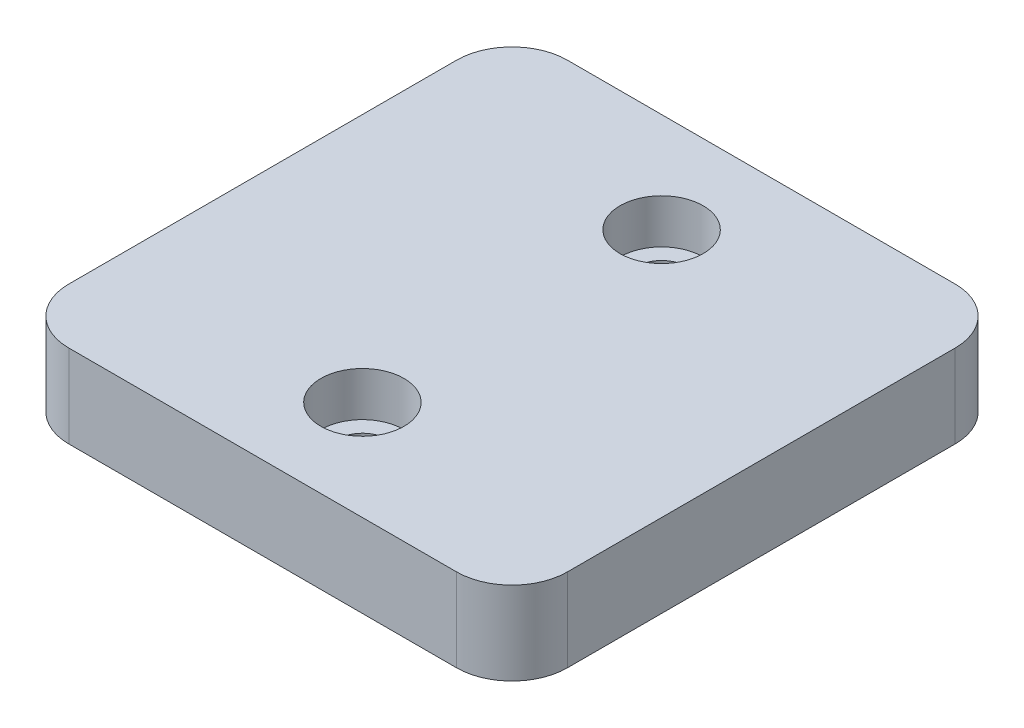
ISO-10303-21;
HEADER;
FILE_DESCRIPTION(('STEP AP214'),'2;1');
FILE_NAME('part.step','',(''),(''),'','','');
FILE_SCHEMA(('AUTOMOTIVE_DESIGN { 1 0 10303 214 1 1 1 1 }'));
ENDSEC;
DATA;
#1=APPLICATION_CONTEXT('core data for automotive mechanical design processes');
#2=APPLICATION_PROTOCOL_DEFINITION('international standard','automotive_design',2000,#1);
#3=PRODUCT_CONTEXT('',#1,'mechanical');
#4=PRODUCT('Part','Part','',(#3));
#5=PRODUCT_RELATED_PRODUCT_CATEGORY('part','',(#4));
#6=PRODUCT_DEFINITION_FORMATION('','',#4);
#7=PRODUCT_DEFINITION_CONTEXT('part definition',#1,'design');
#8=PRODUCT_DEFINITION('design','',#6,#7);
#9=PRODUCT_DEFINITION_SHAPE('','',#8);
#10=(LENGTH_UNIT() NAMED_UNIT(*) SI_UNIT(.MILLI.,.METRE.));
#11=(NAMED_UNIT(*) PLANE_ANGLE_UNIT() SI_UNIT($,.RADIAN.));
#12=(NAMED_UNIT(*) SI_UNIT($,.STERADIAN.) SOLID_ANGLE_UNIT());
#13=UNCERTAINTY_MEASURE_WITH_UNIT(LENGTH_MEASURE(1.E-05),#10,'distance_accuracy_value','');
#14=(GEOMETRIC_REPRESENTATION_CONTEXT(3) GLOBAL_UNCERTAINTY_ASSIGNED_CONTEXT((#13)) GLOBAL_UNIT_ASSIGNED_CONTEXT((#10,
#11,#12)) REPRESENTATION_CONTEXT('',''));
#15=CARTESIAN_POINT('',(0.,0.,0.));
#16=DIRECTION('',(0.,0.,1.));
#17=DIRECTION('',(1.,0.,0.));
#18=AXIS2_PLACEMENT_3D('',#15,#16,#17);
#19=CARTESIAN_POINT('',(35.,15.,35.));
#20=DIRECTION('',(0.,-1.,0.));
#21=DIRECTION('',(0.,0.,-1.));
#22=AXIS2_PLACEMENT_3D('',#19,#20,#21);
#23=CYLINDRICAL_SURFACE('',#22,10.);
#24=CARTESIAN_POINT('',(35.,0.,35.));
#25=DIRECTION('',(0.,1.,0.));
#26=DIRECTION('',(0.,0.,1.));
#27=AXIS2_PLACEMENT_3D('',#24,#25,#26);
#28=CIRCLE('',#27,10.);
#29=CARTESIAN_POINT('',(34.9999999999999,0.,45.));
#30=VERTEX_POINT('',#29);
#31=CARTESIAN_POINT('',(45.,0.,34.9999999999999));
#32=VERTEX_POINT('',#31);
#33=EDGE_CURVE('E134',#30,#32,#28,.T.);
#34=ORIENTED_EDGE('',*,*,#33,.T.);
#35=DIRECTION('',(0.,-1.,0.));
#36=VECTOR('',#35,1.);
#37=CARTESIAN_POINT('',(45.,15.,34.9999999999999));
#38=LINE('',#37,#36);
#39=CARTESIAN_POINT('',(45.,15.,34.9999999999999));
#40=VERTEX_POINT('',#39);
#41=EDGE_CURVE('E11',#40,#32,#38,.T.);
#42=ORIENTED_EDGE('',*,*,#41,.F.);
#43=CARTESIAN_POINT('',(35.,15.,35.));
#44=DIRECTION('',(0.,1.,0.));
#45=DIRECTION('',(0.,0.,1.));
#46=AXIS2_PLACEMENT_3D('',#43,#44,#45);
#47=CIRCLE('',#46,10.);
#48=CARTESIAN_POINT('',(34.9999999999999,15.,45.));
#49=VERTEX_POINT('',#48);
#50=EDGE_CURVE('E149',#49,#40,#47,.T.);
#51=ORIENTED_EDGE('',*,*,#50,.F.);
#52=DIRECTION('',(0.,-1.,0.));
#53=VECTOR('',#52,1.);
#54=CARTESIAN_POINT('',(34.9999999999999,15.,45.));
#55=LINE('',#54,#53);
#56=EDGE_CURVE('E130',#49,#30,#55,.T.);
#57=ORIENTED_EDGE('',*,*,#56,.T.);
#58=EDGE_LOOP('',(#34,#42,#51,#57));
#59=FACE_BOUND('',#58,.T.);
#60=ADVANCED_FACE('F36',(#59),#23,.T.);
#61=CARTESIAN_POINT('',(45.,15.,-34.9999999999999));
#62=DIRECTION('',(-1.,0.,0.));
#63=DIRECTION('',(0.,0.,1.));
#64=AXIS2_PLACEMENT_3D('',#61,#62,#63);
#65=PLANE('',#64);
#66=DIRECTION('',(0.,0.,-1.));
#67=VECTOR('',#66,1.);
#68=CARTESIAN_POINT('',(45.,0.,-34.9999999999999));
#69=LINE('',#68,#67);
#70=CARTESIAN_POINT('',(45.,0.,-34.9999999999999));
#71=VERTEX_POINT('',#70);
#72=EDGE_CURVE('E137',#32,#71,#69,.T.);
#73=ORIENTED_EDGE('',*,*,#72,.T.);
#74=DIRECTION('',(0.,-1.,0.));
#75=VECTOR('',#74,1.);
#76=CARTESIAN_POINT('',(45.,15.,-34.9999999999999));
#77=LINE('',#76,#75);
#78=CARTESIAN_POINT('',(45.,15.,-34.9999999999999));
#79=VERTEX_POINT('',#78);
#80=EDGE_CURVE('E45',#79,#71,#77,.T.);
#81=ORIENTED_EDGE('',*,*,#80,.F.);
#82=DIRECTION('',(0.,0.,-1.));
#83=VECTOR('',#82,1.);
#84=CARTESIAN_POINT('',(45.,15.,-34.9999999999999));
#85=LINE('',#84,#83);
#86=EDGE_CURVE('E97',#40,#79,#85,.T.);
#87=ORIENTED_EDGE('',*,*,#86,.F.);
#88=ORIENTED_EDGE('',*,*,#41,.T.);
#89=EDGE_LOOP('',(#73,#81,#87,#88));
#90=FACE_BOUND('',#89,.T.);
#91=ADVANCED_FACE('F219',(#90),#65,.F.);
#92=CARTESIAN_POINT('',(35.,15.,-35.));
#93=DIRECTION('',(0.,-1.,0.));
#94=DIRECTION('',(0.,0.,-1.));
#95=AXIS2_PLACEMENT_3D('',#92,#93,#94);
#96=CYLINDRICAL_SURFACE('',#95,10.);
#97=CARTESIAN_POINT('',(35.,0.,-35.));
#98=DIRECTION('',(0.,1.,0.));
#99=DIRECTION('',(0.,0.,-1.));
#100=AXIS2_PLACEMENT_3D('',#97,#98,#99);
#101=CIRCLE('',#100,10.);
#102=CARTESIAN_POINT('',(34.9999999999999,0.,-45.));
#103=VERTEX_POINT('',#102);
#104=EDGE_CURVE('E140',#71,#103,#101,.T.);
#105=ORIENTED_EDGE('',*,*,#104,.T.);
#106=DIRECTION('',(0.,-1.,0.));
#107=VECTOR('',#106,1.);
#108=CARTESIAN_POINT('',(34.9999999999999,15.,-45.));
#109=LINE('',#108,#107);
#110=CARTESIAN_POINT('',(34.9999999999999,15.,-45.));
#111=VERTEX_POINT('',#110);
#112=EDGE_CURVE('E156',#111,#103,#109,.T.);
#113=ORIENTED_EDGE('',*,*,#112,.F.);
#114=CARTESIAN_POINT('',(35.,15.,-35.));
#115=DIRECTION('',(0.,1.,0.));
#116=DIRECTION('',(0.,0.,-1.));
#117=AXIS2_PLACEMENT_3D('',#114,#115,#116);
#118=CIRCLE('',#117,10.);
#119=EDGE_CURVE('E187',#79,#111,#118,.T.);
#120=ORIENTED_EDGE('',*,*,#119,.F.);
#121=ORIENTED_EDGE('',*,*,#80,.T.);
#122=EDGE_LOOP('',(#105,#113,#120,#121));
#123=FACE_BOUND('',#122,.T.);
#124=ADVANCED_FACE('F223',(#123),#96,.T.);
#125=CARTESIAN_POINT('',(-34.9999999999999,15.,-45.));
#126=DIRECTION('',(0.,0.,1.));
#127=DIRECTION('',(1.,0.,0.));
#128=AXIS2_PLACEMENT_3D('',#125,#126,#127);
#129=PLANE('',#128);
#130=DIRECTION('',(-1.,0.,0.));
#131=VECTOR('',#130,1.);
#132=CARTESIAN_POINT('',(-34.9999999999999,0.,-45.));
#133=LINE('',#132,#131);
#134=CARTESIAN_POINT('',(-34.9999999999999,0.,-45.));
#135=VERTEX_POINT('',#134);
#136=EDGE_CURVE('E142',#103,#135,#133,.T.);
#137=ORIENTED_EDGE('',*,*,#136,.T.);
#138=DIRECTION('',(0.,-1.,0.));
#139=VECTOR('',#138,1.);
#140=CARTESIAN_POINT('',(-34.9999999999999,15.,-45.));
#141=LINE('',#140,#139);
#142=CARTESIAN_POINT('',(-34.9999999999999,15.,-45.));
#143=VERTEX_POINT('',#142);
#144=EDGE_CURVE('E153',#143,#135,#141,.T.);
#145=ORIENTED_EDGE('',*,*,#144,.F.);
#146=DIRECTION('',(-1.,0.,0.));
#147=VECTOR('',#146,1.);
#148=CARTESIAN_POINT('',(-34.9999999999999,15.,-45.));
#149=LINE('',#148,#147);
#150=EDGE_CURVE('E189',#111,#143,#149,.T.);
#151=ORIENTED_EDGE('',*,*,#150,.F.);
#152=ORIENTED_EDGE('',*,*,#112,.T.);
#153=EDGE_LOOP('',(#137,#145,#151,#152));
#154=FACE_BOUND('',#153,.T.);
#155=ADVANCED_FACE('F195',(#154),#129,.F.);
#156=CARTESIAN_POINT('',(-35.,15.,-35.));
#157=DIRECTION('',(0.,-1.,0.));
#158=DIRECTION('',(0.,0.,-1.));
#159=AXIS2_PLACEMENT_3D('',#156,#157,#158);
#160=CYLINDRICAL_SURFACE('',#159,10.);
#161=CARTESIAN_POINT('',(-35.,0.,-35.));
#162=DIRECTION('',(0.,1.,0.));
#163=DIRECTION('',(0.,0.,1.));
#164=AXIS2_PLACEMENT_3D('',#161,#162,#163);
#165=CIRCLE('',#164,10.);
#166=CARTESIAN_POINT('',(-45.,0.,-34.9999999999999));
#167=VERTEX_POINT('',#166);
#168=EDGE_CURVE('E144',#135,#167,#165,.T.);
#169=ORIENTED_EDGE('',*,*,#168,.T.);
#170=DIRECTION('',(0.,-1.,0.));
#171=VECTOR('',#170,1.);
#172=CARTESIAN_POINT('',(-45.,15.,-34.9999999999999));
#173=LINE('',#172,#171);
#174=CARTESIAN_POINT('',(-45.,15.,-34.9999999999999));
#175=VERTEX_POINT('',#174);
#176=EDGE_CURVE('E125',#175,#167,#173,.T.);
#177=ORIENTED_EDGE('',*,*,#176,.F.);
#178=CARTESIAN_POINT('',(-35.,15.,-35.));
#179=DIRECTION('',(0.,1.,0.));
#180=DIRECTION('',(0.,0.,1.));
#181=AXIS2_PLACEMENT_3D('',#178,#179,#180);
#182=CIRCLE('',#181,10.);
#183=EDGE_CURVE('E116',#143,#175,#182,.T.);
#184=ORIENTED_EDGE('',*,*,#183,.F.);
#185=ORIENTED_EDGE('',*,*,#144,.T.);
#186=EDGE_LOOP('',(#169,#177,#184,#185));
#187=FACE_BOUND('',#186,.T.);
#188=ADVANCED_FACE('F199',(#187),#160,.T.);
#189=CARTESIAN_POINT('',(-45.,15.,-34.9999999999999));
#190=DIRECTION('',(1.,0.,0.));
#191=DIRECTION('',(0.,0.,-1.));
#192=AXIS2_PLACEMENT_3D('',#189,#190,#191);
#193=PLANE('',#192);
#194=DIRECTION('',(0.,0.,1.));
#195=VECTOR('',#194,1.);
#196=CARTESIAN_POINT('',(-45.,0.,-34.9999999999999));
#197=LINE('',#196,#195);
#198=CARTESIAN_POINT('',(-45.,0.,34.9999999999999));
#199=VERTEX_POINT('',#198);
#200=EDGE_CURVE('E124',#167,#199,#197,.T.);
#201=ORIENTED_EDGE('',*,*,#200,.T.);
#202=DIRECTION('',(0.,-1.,0.));
#203=VECTOR('',#202,1.);
#204=CARTESIAN_POINT('',(-45.,15.,34.9999999999999));
#205=LINE('',#204,#203);
#206=CARTESIAN_POINT('',(-45.,15.,34.9999999999999));
#207=VERTEX_POINT('',#206);
#208=EDGE_CURVE('E121',#207,#199,#205,.T.);
#209=ORIENTED_EDGE('',*,*,#208,.F.);
#210=DIRECTION('',(0.,0.,1.));
#211=VECTOR('',#210,1.);
#212=CARTESIAN_POINT('',(-45.,15.,-34.9999999999999));
#213=LINE('',#212,#211);
#214=EDGE_CURVE('E110',#175,#207,#213,.T.);
#215=ORIENTED_EDGE('',*,*,#214,.F.);
#216=ORIENTED_EDGE('',*,*,#176,.T.);
#217=EDGE_LOOP('',(#201,#209,#215,#216));
#218=FACE_BOUND('',#217,.T.);
#219=ADVANCED_FACE('F122',(#218),#193,.F.);
#220=CARTESIAN_POINT('',(-35.,15.,35.));
#221=DIRECTION('',(0.,-1.,0.));
#222=DIRECTION('',(0.,0.,-1.));
#223=AXIS2_PLACEMENT_3D('',#220,#221,#222);
#224=CYLINDRICAL_SURFACE('',#223,10.);
#225=CARTESIAN_POINT('',(-35.,0.,35.));
#226=DIRECTION('',(0.,1.,0.));
#227=DIRECTION('',(0.,0.,1.));
#228=AXIS2_PLACEMENT_3D('',#225,#226,#227);
#229=CIRCLE('',#228,10.);
#230=CARTESIAN_POINT('',(-34.9999999999999,0.,45.));
#231=VERTEX_POINT('',#230);
#232=EDGE_CURVE('E83',#199,#231,#229,.T.);
#233=ORIENTED_EDGE('',*,*,#232,.T.);
#234=DIRECTION('',(0.,-1.,0.));
#235=VECTOR('',#234,1.);
#236=CARTESIAN_POINT('',(-34.9999999999999,15.,45.));
#237=LINE('',#236,#235);
#238=CARTESIAN_POINT('',(-34.9999999999999,15.,45.));
#239=VERTEX_POINT('',#238);
#240=EDGE_CURVE('E126',#239,#231,#237,.T.);
#241=ORIENTED_EDGE('',*,*,#240,.F.);
#242=CARTESIAN_POINT('',(-35.,15.,35.));
#243=DIRECTION('',(0.,1.,0.));
#244=DIRECTION('',(0.,0.,1.));
#245=AXIS2_PLACEMENT_3D('',#242,#243,#244);
#246=CIRCLE('',#245,10.);
#247=EDGE_CURVE('E114',#207,#239,#246,.T.);
#248=ORIENTED_EDGE('',*,*,#247,.F.);
#249=ORIENTED_EDGE('',*,*,#208,.T.);
#250=EDGE_LOOP('',(#233,#241,#248,#249));
#251=FACE_BOUND('',#250,.T.);
#252=ADVANCED_FACE('F128',(#251),#224,.T.);
#253=CARTESIAN_POINT('',(-34.9999999999999,15.,45.));
#254=DIRECTION('',(0.,0.,-1.));
#255=DIRECTION('',(-1.,0.,0.));
#256=AXIS2_PLACEMENT_3D('',#253,#254,#255);
#257=PLANE('',#256);
#258=DIRECTION('',(1.,0.,0.));
#259=VECTOR('',#258,1.);
#260=CARTESIAN_POINT('',(-34.9999999999999,0.,45.));
#261=LINE('',#260,#259);
#262=EDGE_CURVE('E89',#231,#30,#261,.T.);
#263=ORIENTED_EDGE('',*,*,#262,.T.);
#264=ORIENTED_EDGE('',*,*,#56,.F.);
#265=DIRECTION('',(1.,0.,0.));
#266=VECTOR('',#265,1.);
#267=CARTESIAN_POINT('',(-34.9999999999999,15.,45.));
#268=LINE('',#267,#266);
#269=EDGE_CURVE('E54',#239,#49,#268,.T.);
#270=ORIENTED_EDGE('',*,*,#269,.F.);
#271=ORIENTED_EDGE('',*,*,#240,.T.);
#272=EDGE_LOOP('',(#263,#264,#270,#271));
#273=FACE_BOUND('',#272,.T.);
#274=ADVANCED_FACE('F207',(#273),#257,.F.);
#275=CARTESIAN_POINT('',(35.,15.,35.));
#276=DIRECTION('',(0.,1.,0.));
#277=DIRECTION('',(0.,0.,1.));
#278=AXIS2_PLACEMENT_3D('',#275,#276,#277);
#279=PLANE('',#278);
#280=CARTESIAN_POINT('',(0.,15.,-27.));
#281=DIRECTION('',(0.,1.,0.));
#282=DIRECTION('',(0.,0.,1.));
#283=AXIS2_PLACEMENT_3D('',#280,#281,#282);
#284=CIRCLE('',#283,7.5);
#285=CARTESIAN_POINT('',(0.,15.,-19.5));
#286=VERTEX_POINT('',#285);
#287=EDGE_CURVE('E177',#286,#286,#284,.T.);
#288=ORIENTED_EDGE('',*,*,#287,.F.);
#289=EDGE_LOOP('',(#288));
#290=FACE_BOUND('',#289,.T.);
#291=CARTESIAN_POINT('',(0.,15.,27.));
#292=DIRECTION('',(0.,1.,0.));
#293=DIRECTION('',(0.,0.,-1.));
#294=AXIS2_PLACEMENT_3D('',#291,#292,#293);
#295=CIRCLE('',#294,7.5);
#296=CARTESIAN_POINT('',(0.,15.,19.5));
#297=VERTEX_POINT('',#296);
#298=EDGE_CURVE('E166',#297,#297,#295,.T.);
#299=ORIENTED_EDGE('',*,*,#298,.F.);
#300=EDGE_LOOP('',(#299));
#301=FACE_BOUND('',#300,.T.);
#302=ORIENTED_EDGE('',*,*,#50,.T.);
#303=ORIENTED_EDGE('',*,*,#86,.T.);
#304=ORIENTED_EDGE('',*,*,#119,.T.);
#305=ORIENTED_EDGE('',*,*,#150,.T.);
#306=ORIENTED_EDGE('',*,*,#183,.T.);
#307=ORIENTED_EDGE('',*,*,#214,.T.);
#308=ORIENTED_EDGE('',*,*,#247,.T.);
#309=ORIENTED_EDGE('',*,*,#269,.T.);
#310=EDGE_LOOP('',(#302,#303,#304,#305,#306,#307,#308,#309));
#311=FACE_BOUND('',#310,.T.);
#312=ADVANCED_FACE('F112',(#290,#301,#311),#279,.T.);
#313=CARTESIAN_POINT('',(35.,0.,35.));
#314=DIRECTION('',(0.,1.,0.));
#315=DIRECTION('',(0.,0.,1.));
#316=AXIS2_PLACEMENT_3D('',#313,#314,#315);
#317=PLANE('',#316);
#318=CARTESIAN_POINT('',(0.,0.,27.));
#319=DIRECTION('',(0.,-1.,0.));
#320=DIRECTION('',(0.,0.,-1.));
#321=AXIS2_PLACEMENT_3D('',#318,#319,#320);
#322=CIRCLE('',#321,4.5);
#323=CARTESIAN_POINT('',(0.,0.,22.5));
#324=VERTEX_POINT('',#323);
#325=EDGE_CURVE('E162',#324,#324,#322,.T.);
#326=ORIENTED_EDGE('',*,*,#325,.F.);
#327=EDGE_LOOP('',(#326));
#328=FACE_BOUND('',#327,.T.);
#329=CARTESIAN_POINT('',(0.,0.,-27.));
#330=DIRECTION('',(0.,-1.,0.));
#331=DIRECTION('',(0.,0.,1.));
#332=AXIS2_PLACEMENT_3D('',#329,#330,#331);
#333=CIRCLE('',#332,4.5);
#334=CARTESIAN_POINT('',(0.,0.,-22.5));
#335=VERTEX_POINT('',#334);
#336=EDGE_CURVE('E168',#335,#335,#333,.T.);
#337=ORIENTED_EDGE('',*,*,#336,.F.);
#338=EDGE_LOOP('',(#337));
#339=FACE_BOUND('',#338,.T.);
#340=ORIENTED_EDGE('',*,*,#33,.F.);
#341=ORIENTED_EDGE('',*,*,#262,.F.);
#342=ORIENTED_EDGE('',*,*,#232,.F.);
#343=ORIENTED_EDGE('',*,*,#200,.F.);
#344=ORIENTED_EDGE('',*,*,#168,.F.);
#345=ORIENTED_EDGE('',*,*,#136,.F.);
#346=ORIENTED_EDGE('',*,*,#104,.F.);
#347=ORIENTED_EDGE('',*,*,#72,.F.);
#348=EDGE_LOOP('',(#340,#341,#342,#343,#344,#345,#346,#347));
#349=FACE_BOUND('',#348,.T.);
#350=ADVANCED_FACE('F202',(#328,#339,#349),#317,.F.);
#351=CARTESIAN_POINT('',(0.,7.,27.));
#352=DIRECTION('',(0.,1.,0.));
#353=DIRECTION('',(0.,0.,1.));
#354=AXIS2_PLACEMENT_3D('',#351,#352,#353);
#355=CYLINDRICAL_SURFACE('',#354,7.5);
#356=CARTESIAN_POINT('',(0.,7.,27.));
#357=DIRECTION('',(0.,1.,0.));
#358=DIRECTION('',(0.,0.,-1.));
#359=AXIS2_PLACEMENT_3D('',#356,#357,#358);
#360=CIRCLE('',#359,7.5);
#361=CARTESIAN_POINT('',(0.,7.,19.5));
#362=VERTEX_POINT('',#361);
#363=EDGE_CURVE('E180',#362,#362,#360,.T.);
#364=ORIENTED_EDGE('',*,*,#363,.F.);
#365=EDGE_LOOP('',(#364));
#366=FACE_BOUND('',#365,.T.);
#367=ORIENTED_EDGE('',*,*,#298,.T.);
#368=EDGE_LOOP('',(#367));
#369=FACE_BOUND('',#368,.T.);
#370=ADVANCED_FACE('F260',(#366,#369),#355,.F.);
#371=CARTESIAN_POINT('',(0.,7.,27.));
#372=DIRECTION('',(0.,-1.,0.));
#373=DIRECTION('',(0.,0.,-1.));
#374=AXIS2_PLACEMENT_3D('',#371,#372,#373);
#375=PLANE('',#374);
#376=CARTESIAN_POINT('',(0.,7.,27.));
#377=DIRECTION('',(0.,-1.,0.));
#378=DIRECTION('',(0.,0.,-1.));
#379=AXIS2_PLACEMENT_3D('',#376,#377,#378);
#380=CIRCLE('',#379,4.5);
#381=CARTESIAN_POINT('',(0.,7.,22.5));
#382=VERTEX_POINT('',#381);
#383=EDGE_CURVE('E39',#382,#382,#380,.T.);
#384=ORIENTED_EDGE('',*,*,#383,.T.);
#385=EDGE_LOOP('',(#384));
#386=FACE_BOUND('',#385,.T.);
#387=ORIENTED_EDGE('',*,*,#363,.T.);
#388=EDGE_LOOP('',(#387));
#389=FACE_BOUND('',#388,.T.);
#390=ADVANCED_FACE('F265',(#386,#389),#375,.F.);
#391=CARTESIAN_POINT('',(0.,7.,-27.));
#392=DIRECTION('',(0.,1.,0.));
#393=DIRECTION('',(0.,0.,1.));
#394=AXIS2_PLACEMENT_3D('',#391,#392,#393);
#395=CYLINDRICAL_SURFACE('',#394,7.5);
#396=CARTESIAN_POINT('',(0.,7.,-27.));
#397=DIRECTION('',(0.,1.,0.));
#398=DIRECTION('',(0.,0.,1.));
#399=AXIS2_PLACEMENT_3D('',#396,#397,#398);
#400=CIRCLE('',#399,7.5);
#401=CARTESIAN_POINT('',(0.,7.,-19.5));
#402=VERTEX_POINT('',#401);
#403=EDGE_CURVE('E138',#402,#402,#400,.T.);
#404=ORIENTED_EDGE('',*,*,#403,.F.);
#405=EDGE_LOOP('',(#404));
#406=FACE_BOUND('',#405,.T.);
#407=ORIENTED_EDGE('',*,*,#287,.T.);
#408=EDGE_LOOP('',(#407));
#409=FACE_BOUND('',#408,.T.);
#410=ADVANCED_FACE('F273',(#406,#409),#395,.F.);
#411=CARTESIAN_POINT('',(0.,7.,-27.));
#412=DIRECTION('',(0.,1.,0.));
#413=DIRECTION('',(0.,0.,1.));
#414=AXIS2_PLACEMENT_3D('',#411,#412,#413);
#415=PLANE('',#414);
#416=CARTESIAN_POINT('',(0.,7.,-27.));
#417=DIRECTION('',(0.,1.,0.));
#418=DIRECTION('',(0.,0.,1.));
#419=AXIS2_PLACEMENT_3D('',#416,#417,#418);
#420=CIRCLE('',#419,4.5);
#421=CARTESIAN_POINT('',(0.,7.,-22.5));
#422=VERTEX_POINT('',#421);
#423=EDGE_CURVE('E160',#422,#422,#420,.T.);
#424=ORIENTED_EDGE('',*,*,#423,.F.);
#425=EDGE_LOOP('',(#424));
#426=FACE_BOUND('',#425,.T.);
#427=ORIENTED_EDGE('',*,*,#403,.T.);
#428=EDGE_LOOP('',(#427));
#429=FACE_BOUND('',#428,.T.);
#430=ADVANCED_FACE('F278',(#426,#429),#415,.T.);
#431=CARTESIAN_POINT('',(0.,15.,-27.));
#432=DIRECTION('',(0.,-1.,0.));
#433=DIRECTION('',(0.,0.,-1.));
#434=AXIS2_PLACEMENT_3D('',#431,#432,#433);
#435=CYLINDRICAL_SURFACE('',#434,4.5);
#436=ORIENTED_EDGE('',*,*,#423,.T.);
#437=EDGE_LOOP('',(#436));
#438=FACE_BOUND('',#437,.T.);
#439=ORIENTED_EDGE('',*,*,#336,.T.);
#440=EDGE_LOOP('',(#439));
#441=FACE_BOUND('',#440,.T.);
#442=ADVANCED_FACE('F301',(#438,#441),#435,.F.);
#443=CARTESIAN_POINT('',(0.,15.,27.));
#444=DIRECTION('',(0.,-1.,0.));
#445=DIRECTION('',(0.,0.,-1.));
#446=AXIS2_PLACEMENT_3D('',#443,#444,#445);
#447=CYLINDRICAL_SURFACE('',#446,4.5);
#448=ORIENTED_EDGE('',*,*,#325,.T.);
#449=EDGE_LOOP('',(#448));
#450=FACE_BOUND('',#449,.T.);
#451=ORIENTED_EDGE('',*,*,#383,.F.);
#452=EDGE_LOOP('',(#451));
#453=FACE_BOUND('',#452,.T.);
#454=ADVANCED_FACE('F311',(#450,#453),#447,.F.);
#455=CLOSED_SHELL('',(#60,#91,#124,#155,#188,#219,#252,#274,#312,#350,#370,#390,#410,#430,#442,#454));
#456=MANIFOLD_SOLID_BREP('B2',#455);
#457=ADVANCED_BREP_SHAPE_REPRESENTATION('',(#18,#456),#14);
#458=SHAPE_DEFINITION_REPRESENTATION(#9,#457);
ENDSEC;
END-ISO-10303-21;
